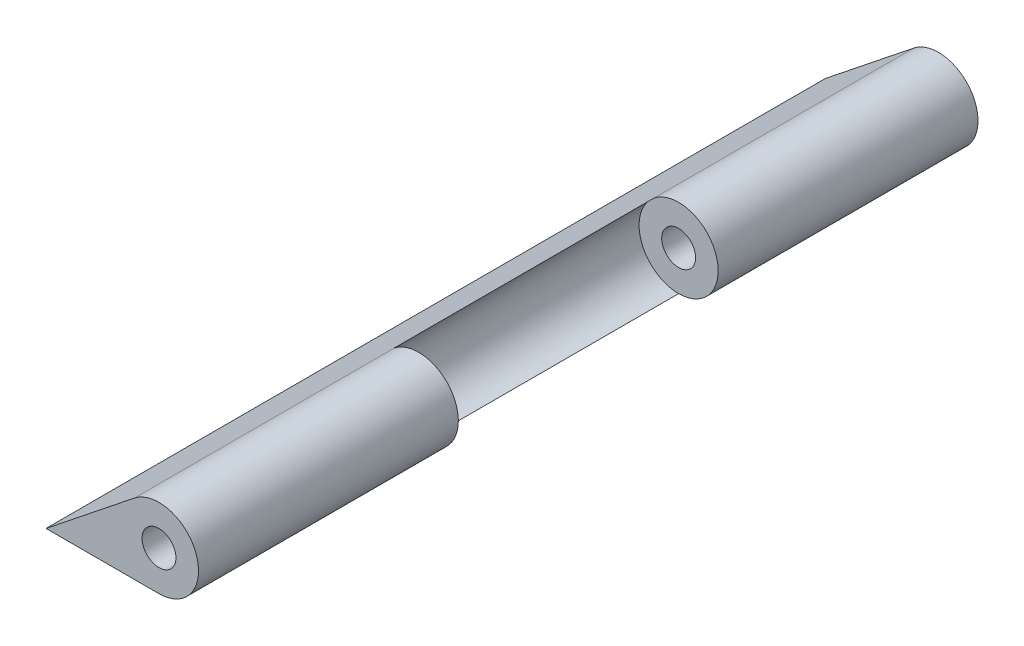
ISO-10303-21;
HEADER;
FILE_DESCRIPTION(('STEP AP214'),'2;1');
FILE_NAME('part.step','',(''),(''),'','','');
FILE_SCHEMA(('AUTOMOTIVE_DESIGN { 1 0 10303 214 1 1 1 1 }'));
ENDSEC;
DATA;
#1=APPLICATION_CONTEXT('core data for automotive mechanical design processes');
#2=APPLICATION_PROTOCOL_DEFINITION('international standard','automotive_design',2000,#1);
#3=PRODUCT_CONTEXT('',#1,'mechanical');
#4=PRODUCT('Part','Part','',(#3));
#5=PRODUCT_RELATED_PRODUCT_CATEGORY('part','',(#4));
#6=PRODUCT_DEFINITION_FORMATION('','',#4);
#7=PRODUCT_DEFINITION_CONTEXT('part definition',#1,'design');
#8=PRODUCT_DEFINITION('design','',#6,#7);
#9=PRODUCT_DEFINITION_SHAPE('','',#8);
#10=(LENGTH_UNIT() NAMED_UNIT(*) SI_UNIT(.MILLI.,.METRE.));
#11=(NAMED_UNIT(*) PLANE_ANGLE_UNIT() SI_UNIT($,.RADIAN.));
#12=(NAMED_UNIT(*) SI_UNIT($,.STERADIAN.) SOLID_ANGLE_UNIT());
#13=UNCERTAINTY_MEASURE_WITH_UNIT(LENGTH_MEASURE(1.E-05),#10,'distance_accuracy_value','');
#14=(GEOMETRIC_REPRESENTATION_CONTEXT(3) GLOBAL_UNCERTAINTY_ASSIGNED_CONTEXT((#13)) GLOBAL_UNIT_ASSIGNED_CONTEXT((#10,
#11,#12)) REPRESENTATION_CONTEXT('',''));
#15=CARTESIAN_POINT('',(0.,0.,0.));
#16=DIRECTION('',(0.,0.,1.));
#17=DIRECTION('',(1.,0.,0.));
#18=AXIS2_PLACEMENT_3D('',#15,#16,#17);
#19=CARTESIAN_POINT('',(0.,0.,34.5));
#20=DIRECTION('',(0.,0.,-1.));
#21=DIRECTION('',(-1.,0.,0.));
#22=AXIS2_PLACEMENT_3D('',#19,#20,#21);
#23=CYLINDRICAL_SURFACE('',#22,3.5);
#24=CARTESIAN_POINT('',(0.,0.,-11.5));
#25=DIRECTION('',(0.,0.,1.));
#26=DIRECTION('',(1.,0.,0.));
#27=AXIS2_PLACEMENT_3D('',#24,#25,#26);
#28=CIRCLE('',#27,3.5);
#29=CARTESIAN_POINT('',(0.,-3.5,-11.5));
#30=VERTEX_POINT('',#29);
#31=CARTESIAN_POINT('',(-2.1826280623608,2.73608017817372,-11.5));
#32=VERTEX_POINT('',#31);
#33=EDGE_CURVE('E102',#30,#32,#28,.T.);
#34=ORIENTED_EDGE('',*,*,#33,.F.);
#35=DIRECTION('',(0.,0.,-1.));
#36=VECTOR('',#35,1.);
#37=CARTESIAN_POINT('',(0.,-3.5,34.5));
#38=LINE('',#37,#36);
#39=CARTESIAN_POINT('',(0.,-3.5,-34.5));
#40=VERTEX_POINT('',#39);
#41=EDGE_CURVE('E116',#30,#40,#38,.T.);
#42=ORIENTED_EDGE('',*,*,#41,.T.);
#43=CARTESIAN_POINT('',(0.,0.,-34.5));
#44=DIRECTION('',(0.,0.,1.));
#45=DIRECTION('',(1.,0.,0.));
#46=AXIS2_PLACEMENT_3D('',#43,#44,#45);
#47=CIRCLE('',#46,3.5);
#48=CARTESIAN_POINT('',(-2.1826280623608,2.73608017817372,-34.5));
#49=VERTEX_POINT('',#48);
#50=EDGE_CURVE('E43',#40,#49,#47,.T.);
#51=ORIENTED_EDGE('',*,*,#50,.T.);
#52=DIRECTION('',(0.,0.,-1.));
#53=VECTOR('',#52,1.);
#54=CARTESIAN_POINT('',(-2.1826280623608,2.73608017817372,34.5));
#55=LINE('',#54,#53);
#56=EDGE_CURVE('E63',#32,#49,#55,.T.);
#57=ORIENTED_EDGE('',*,*,#56,.F.);
#58=EDGE_LOOP('',(#34,#42,#51,#57));
#59=FACE_BOUND('',#58,.T.);
#60=ADVANCED_FACE('F39',(#59),#23,.T.);
#61=CARTESIAN_POINT('',(0.,0.,34.5));
#62=DIRECTION('',(0.,0.,-1.));
#63=DIRECTION('',(-1.,0.,0.));
#64=AXIS2_PLACEMENT_3D('',#61,#62,#63);
#65=CYLINDRICAL_SURFACE('',#64,1.5);
#66=CARTESIAN_POINT('',(0.,0.,-34.5));
#67=DIRECTION('',(0.,0.,1.));
#68=DIRECTION('',(1.,0.,0.));
#69=AXIS2_PLACEMENT_3D('',#66,#67,#68);
#70=CIRCLE('',#69,1.5);
#71=CARTESIAN_POINT('',(1.5,0.,-34.5));
#72=VERTEX_POINT('',#71);
#73=EDGE_CURVE('E132',#72,#72,#70,.T.);
#74=ORIENTED_EDGE('',*,*,#73,.F.);
#75=EDGE_LOOP('',(#74));
#76=FACE_BOUND('',#75,.T.);
#77=CARTESIAN_POINT('',(0.,0.,-11.5));
#78=DIRECTION('',(0.,0.,1.));
#79=DIRECTION('',(1.,0.,0.));
#80=AXIS2_PLACEMENT_3D('',#77,#78,#79);
#81=CIRCLE('',#80,1.5);
#82=CARTESIAN_POINT('',(1.5,0.,-11.5));
#83=VERTEX_POINT('',#82);
#84=EDGE_CURVE('E94',#83,#83,#81,.T.);
#85=ORIENTED_EDGE('',*,*,#84,.T.);
#86=EDGE_LOOP('',(#85));
#87=FACE_BOUND('',#86,.T.);
#88=ADVANCED_FACE('F143',(#76,#87),#65,.F.);
#89=CARTESIAN_POINT('',(0.,-3.5,34.5));
#90=VERTEX_POINT('',#89);
#91=CARTESIAN_POINT('',(0.,-3.5,11.5));
#92=VERTEX_POINT('',#91);
#93=EDGE_CURVE('E108',#90,#92,#38,.T.);
#94=ORIENTED_EDGE('',*,*,#93,.T.);
#95=CARTESIAN_POINT('',(0.,0.,11.5));
#96=DIRECTION('',(0.,0.,1.));
#97=DIRECTION('',(1.,0.,0.));
#98=AXIS2_PLACEMENT_3D('',#95,#96,#97);
#99=CIRCLE('',#98,3.5);
#100=CARTESIAN_POINT('',(-2.1826280623608,2.73608017817372,11.5));
#101=VERTEX_POINT('',#100);
#102=EDGE_CURVE('E99',#92,#101,#99,.T.);
#103=ORIENTED_EDGE('',*,*,#102,.T.);
#104=CARTESIAN_POINT('',(-2.1826280623608,2.73608017817372,34.5));
#105=VERTEX_POINT('',#104);
#106=EDGE_CURVE('E106',#105,#101,#55,.T.);
#107=ORIENTED_EDGE('',*,*,#106,.F.);
#108=CARTESIAN_POINT('',(0.,0.,34.5));
#109=DIRECTION('',(0.,0.,1.));
#110=DIRECTION('',(1.,0.,0.));
#111=AXIS2_PLACEMENT_3D('',#108,#109,#110);
#112=CIRCLE('',#111,3.5);
#113=EDGE_CURVE('E11',#90,#105,#112,.T.);
#114=ORIENTED_EDGE('',*,*,#113,.F.);
#115=EDGE_LOOP('',(#94,#103,#107,#114));
#116=FACE_BOUND('',#115,.T.);
#117=ADVANCED_FACE('F41',(#116),#23,.T.);
#118=CARTESIAN_POINT('',(0.,0.,34.5));
#119=DIRECTION('',(0.,0.,1.));
#120=DIRECTION('',(1.,0.,0.));
#121=AXIS2_PLACEMENT_3D('',#118,#119,#120);
#122=PLANE('',#121);
#123=ORIENTED_EDGE('',*,*,#113,.T.);
#124=DIRECTION('',(-0.78173719376392,-0.623608017817372,0.));
#125=VECTOR('',#124,1.);
#126=CARTESIAN_POINT('',(-10.,-3.5,34.5));
#127=LINE('',#126,#125);
#128=CARTESIAN_POINT('',(-10.,-3.5,34.5));
#129=VERTEX_POINT('',#128);
#130=EDGE_CURVE('E114',#105,#129,#127,.T.);
#131=ORIENTED_EDGE('',*,*,#130,.T.);
#132=DIRECTION('',(1.,0.,0.));
#133=VECTOR('',#132,1.);
#134=CARTESIAN_POINT('',(0.,-3.5,34.5));
#135=LINE('',#134,#133);
#136=EDGE_CURVE('E122',#129,#90,#135,.T.);
#137=ORIENTED_EDGE('',*,*,#136,.T.);
#138=EDGE_LOOP('',(#123,#131,#137));
#139=FACE_BOUND('',#138,.T.);
#140=CARTESIAN_POINT('',(0.,0.,34.5));
#141=DIRECTION('',(0.,0.,1.));
#142=DIRECTION('',(1.,0.,0.));
#143=AXIS2_PLACEMENT_3D('',#140,#141,#142);
#144=CIRCLE('',#143,1.5);
#145=CARTESIAN_POINT('',(1.5,0.,34.5));
#146=VERTEX_POINT('',#145);
#147=EDGE_CURVE('E133',#146,#146,#144,.T.);
#148=ORIENTED_EDGE('',*,*,#147,.F.);
#149=EDGE_LOOP('',(#148));
#150=FACE_BOUND('',#149,.T.);
#151=ADVANCED_FACE('F192',(#139,#150),#122,.T.);
#152=CARTESIAN_POINT('',(0.,0.,-34.5));
#153=DIRECTION('',(0.,0.,1.));
#154=DIRECTION('',(1.,0.,0.));
#155=AXIS2_PLACEMENT_3D('',#152,#153,#154);
#156=PLANE('',#155);
#157=ORIENTED_EDGE('',*,*,#50,.F.);
#158=DIRECTION('',(1.,0.,0.));
#159=VECTOR('',#158,1.);
#160=CARTESIAN_POINT('',(0.,-3.5,-34.5));
#161=LINE('',#160,#159);
#162=CARTESIAN_POINT('',(-10.,-3.5,-34.5));
#163=VERTEX_POINT('',#162);
#164=EDGE_CURVE('E124',#163,#40,#161,.T.);
#165=ORIENTED_EDGE('',*,*,#164,.F.);
#166=DIRECTION('',(-0.78173719376392,-0.623608017817372,0.));
#167=VECTOR('',#166,1.);
#168=CARTESIAN_POINT('',(-10.,-3.5,-34.5));
#169=LINE('',#168,#167);
#170=EDGE_CURVE('E93',#49,#163,#169,.T.);
#171=ORIENTED_EDGE('',*,*,#170,.F.);
#172=EDGE_LOOP('',(#157,#165,#171));
#173=FACE_BOUND('',#172,.T.);
#174=ORIENTED_EDGE('',*,*,#73,.T.);
#175=EDGE_LOOP('',(#174));
#176=FACE_BOUND('',#175,.T.);
#177=ADVANCED_FACE('F141',(#173,#176),#156,.F.);
#178=CARTESIAN_POINT('',(0.,0.,11.5));
#179=DIRECTION('',(0.,0.,1.));
#180=DIRECTION('',(1.,0.,0.));
#181=AXIS2_PLACEMENT_3D('',#178,#179,#180);
#182=CIRCLE('',#181,1.5);
#183=CARTESIAN_POINT('',(1.5,0.,11.5));
#184=VERTEX_POINT('',#183);
#185=EDGE_CURVE('E152',#184,#184,#182,.T.);
#186=ORIENTED_EDGE('',*,*,#185,.F.);
#187=EDGE_LOOP('',(#186));
#188=FACE_BOUND('',#187,.T.);
#189=ORIENTED_EDGE('',*,*,#147,.T.);
#190=EDGE_LOOP('',(#189));
#191=FACE_BOUND('',#190,.T.);
#192=ADVANCED_FACE('F147',(#188,#191),#65,.F.);
#193=CARTESIAN_POINT('',(-10.,-3.5,34.5));
#194=DIRECTION('',(0.623608017817372,-0.78173719376392,0.));
#195=DIRECTION('',(0.78173719376392,0.623608017817372,0.));
#196=AXIS2_PLACEMENT_3D('',#193,#194,#195);
#197=PLANE('',#196);
#198=ORIENTED_EDGE('',*,*,#170,.T.);
#199=DIRECTION('',(0.,0.,-1.));
#200=VECTOR('',#199,1.);
#201=CARTESIAN_POINT('',(-10.,-3.5,34.5));
#202=LINE('',#201,#200);
#203=EDGE_CURVE('E128',#129,#163,#202,.T.);
#204=ORIENTED_EDGE('',*,*,#203,.F.);
#205=ORIENTED_EDGE('',*,*,#130,.F.);
#206=ORIENTED_EDGE('',*,*,#106,.T.);
#207=DIRECTION('',(0.,0.,1.));
#208=VECTOR('',#207,1.);
#209=CARTESIAN_POINT('',(-2.1826280623608,2.73608017817372,-11.5));
#210=LINE('',#209,#208);
#211=EDGE_CURVE('E87',#32,#101,#210,.T.);
#212=ORIENTED_EDGE('',*,*,#211,.F.);
#213=ORIENTED_EDGE('',*,*,#56,.T.);
#214=EDGE_LOOP('',(#198,#204,#205,#206,#212,#213));
#215=FACE_BOUND('',#214,.T.);
#216=ADVANCED_FACE('F111',(#215),#197,.F.);
#217=CARTESIAN_POINT('',(0.,-3.5,34.5));
#218=DIRECTION('',(0.,1.,0.));
#219=DIRECTION('',(-1.,0.,0.));
#220=AXIS2_PLACEMENT_3D('',#217,#218,#219);
#221=PLANE('',#220);
#222=ORIENTED_EDGE('',*,*,#164,.T.);
#223=ORIENTED_EDGE('',*,*,#41,.F.);
#224=EDGE_CURVE('E120',#92,#30,#38,.T.);
#225=ORIENTED_EDGE('',*,*,#224,.F.);
#226=ORIENTED_EDGE('',*,*,#93,.F.);
#227=ORIENTED_EDGE('',*,*,#136,.F.);
#228=ORIENTED_EDGE('',*,*,#203,.T.);
#229=EDGE_LOOP('',(#222,#223,#225,#226,#227,#228));
#230=FACE_BOUND('',#229,.T.);
#231=ADVANCED_FACE('F168',(#230),#221,.F.);
#232=CARTESIAN_POINT('',(0.,0.,-11.5));
#233=DIRECTION('',(0.,0.,1.));
#234=DIRECTION('',(1.,0.,0.));
#235=AXIS2_PLACEMENT_3D('',#232,#233,#234);
#236=CYLINDRICAL_SURFACE('',#235,3.5);
#237=ORIENTED_EDGE('',*,*,#211,.T.);
#238=EDGE_CURVE('E55',#101,#92,#99,.T.);
#239=ORIENTED_EDGE('',*,*,#238,.T.);
#240=ORIENTED_EDGE('',*,*,#224,.T.);
#241=EDGE_CURVE('E90',#32,#30,#28,.T.);
#242=ORIENTED_EDGE('',*,*,#241,.F.);
#243=EDGE_LOOP('',(#237,#239,#240,#242));
#244=FACE_BOUND('',#243,.T.);
#245=ADVANCED_FACE('F88',(#244),#236,.F.);
#246=CARTESIAN_POINT('',(0.,0.,-11.5));
#247=DIRECTION('',(0.,0.,1.));
#248=DIRECTION('',(1.,0.,0.));
#249=AXIS2_PLACEMENT_3D('',#246,#247,#248);
#250=PLANE('',#249);
#251=ORIENTED_EDGE('',*,*,#84,.F.);
#252=EDGE_LOOP('',(#251));
#253=FACE_BOUND('',#252,.T.);
#254=ORIENTED_EDGE('',*,*,#241,.T.);
#255=ORIENTED_EDGE('',*,*,#33,.T.);
#256=EDGE_LOOP('',(#254,#255));
#257=FACE_BOUND('',#256,.T.);
#258=ADVANCED_FACE('F178',(#253,#257),#250,.T.);
#259=CARTESIAN_POINT('',(0.,0.,11.5));
#260=DIRECTION('',(0.,0.,1.));
#261=DIRECTION('',(1.,0.,0.));
#262=AXIS2_PLACEMENT_3D('',#259,#260,#261);
#263=PLANE('',#262);
#264=ORIENTED_EDGE('',*,*,#185,.T.);
#265=EDGE_LOOP('',(#264));
#266=FACE_BOUND('',#265,.T.);
#267=ORIENTED_EDGE('',*,*,#238,.F.);
#268=ORIENTED_EDGE('',*,*,#102,.F.);
#269=EDGE_LOOP('',(#267,#268));
#270=FACE_BOUND('',#269,.T.);
#271=ADVANCED_FACE('F98',(#266,#270),#263,.F.);
#272=CLOSED_SHELL('',(#60,#88,#117,#151,#177,#192,#216,#231,#245,#258,#271));
#273=MANIFOLD_SOLID_BREP('B2',#272);
#274=ADVANCED_BREP_SHAPE_REPRESENTATION('',(#18,#273),#14);
#275=SHAPE_DEFINITION_REPRESENTATION(#9,#274);
ENDSEC;
END-ISO-10303-21;
